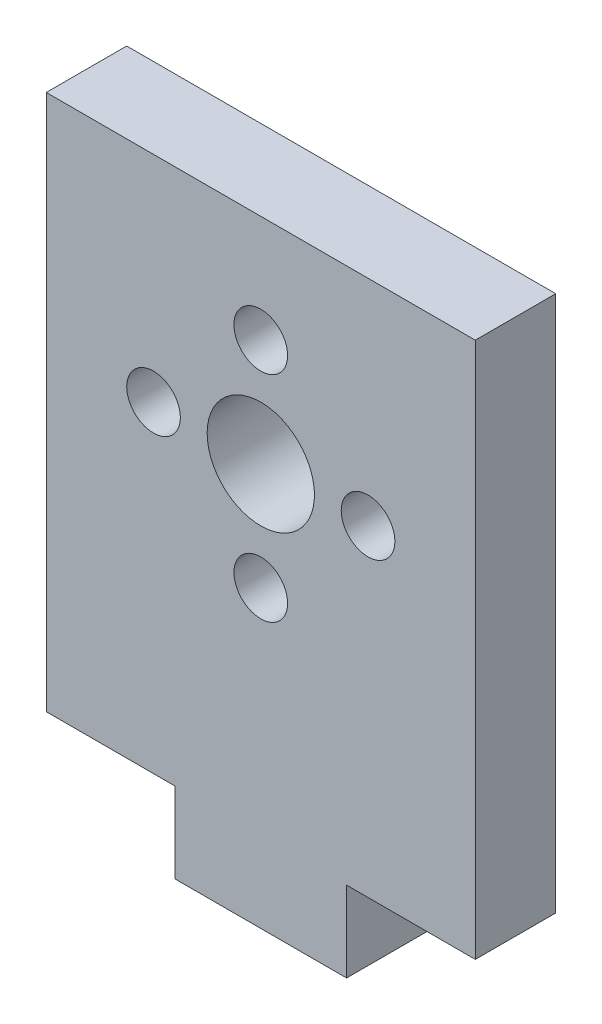
ISO-10303-21;
HEADER;
FILE_DESCRIPTION(('STEP AP214'),'2;1');
FILE_NAME('part.step','',(''),(''),'','','');
FILE_SCHEMA(('AUTOMOTIVE_DESIGN { 1 0 10303 214 1 1 1 1 }'));
ENDSEC;
DATA;
#1=APPLICATION_CONTEXT('core data for automotive mechanical design processes');
#2=APPLICATION_PROTOCOL_DEFINITION('international standard','automotive_design',2000,#1);
#3=PRODUCT_CONTEXT('',#1,'mechanical');
#4=PRODUCT('Part','Part','',(#3));
#5=PRODUCT_RELATED_PRODUCT_CATEGORY('part','',(#4));
#6=PRODUCT_DEFINITION_FORMATION('','',#4);
#7=PRODUCT_DEFINITION_CONTEXT('part definition',#1,'design');
#8=PRODUCT_DEFINITION('design','',#6,#7);
#9=PRODUCT_DEFINITION_SHAPE('','',#8);
#10=(LENGTH_UNIT() NAMED_UNIT(*) SI_UNIT(.MILLI.,.METRE.));
#11=(NAMED_UNIT(*) PLANE_ANGLE_UNIT() SI_UNIT($,.RADIAN.));
#12=(NAMED_UNIT(*) SI_UNIT($,.STERADIAN.) SOLID_ANGLE_UNIT());
#13=UNCERTAINTY_MEASURE_WITH_UNIT(LENGTH_MEASURE(1.E-05),#10,'distance_accuracy_value','');
#14=(GEOMETRIC_REPRESENTATION_CONTEXT(3) GLOBAL_UNCERTAINTY_ASSIGNED_CONTEXT((#13)) GLOBAL_UNIT_ASSIGNED_CONTEXT((#10,
#11,#12)) REPRESENTATION_CONTEXT('',''));
#15=CARTESIAN_POINT('',(0.,0.,0.));
#16=DIRECTION('',(0.,0.,1.));
#17=DIRECTION('',(1.,0.,0.));
#18=AXIS2_PLACEMENT_3D('',#15,#16,#17);
#19=CARTESIAN_POINT('',(0.,0.,4.7625));
#20=DIRECTION('',(0.,0.,1.));
#21=DIRECTION('',(1.,0.,0.));
#22=AXIS2_PLACEMENT_3D('',#19,#20,#21);
#23=PLANE('',#22);
#24=CARTESIAN_POINT('',(6.35,19.05,4.7625));
#25=DIRECTION('',(0.,0.,1.));
#26=DIRECTION('',(1.,0.,0.));
#27=AXIS2_PLACEMENT_3D('',#24,#25,#26);
#28=CIRCLE('',#27,1.5875);
#29=CARTESIAN_POINT('',(4.7625,19.05,4.7625));
#30=VERTEX_POINT('',#29);
#31=EDGE_CURVE('E194',#30,#30,#28,.T.);
#32=ORIENTED_EDGE('',*,*,#31,.F.);
#33=EDGE_LOOP('',(#32));
#34=FACE_BOUND('',#33,.T.);
#35=CARTESIAN_POINT('',(12.7,25.4,4.7625));
#36=DIRECTION('',(0.,0.,1.));
#37=DIRECTION('',(1.,0.,0.));
#38=AXIS2_PLACEMENT_3D('',#35,#36,#37);
#39=CIRCLE('',#38,1.5875);
#40=CARTESIAN_POINT('',(11.1125,25.4,4.7625));
#41=VERTEX_POINT('',#40);
#42=EDGE_CURVE('E182',#41,#41,#39,.T.);
#43=ORIENTED_EDGE('',*,*,#42,.F.);
#44=EDGE_LOOP('',(#43));
#45=FACE_BOUND('',#44,.T.);
#46=DIRECTION('',(1.,0.,0.));
#47=VECTOR('',#46,1.);
#48=CARTESIAN_POINT('',(7.62,-4.7625,4.7625));
#49=LINE('',#48,#47);
#50=CARTESIAN_POINT('',(7.62,-4.7625,4.7625));
#51=VERTEX_POINT('',#50);
#52=CARTESIAN_POINT('',(17.78,-4.7625,4.7625));
#53=VERTEX_POINT('',#52);
#54=EDGE_CURVE('E145',#51,#53,#49,.T.);
#55=ORIENTED_EDGE('',*,*,#54,.T.);
#56=DIRECTION('',(0.,1.,0.));
#57=VECTOR('',#56,1.);
#58=CARTESIAN_POINT('',(17.78,-4.7625,4.7625));
#59=LINE('',#58,#57);
#60=CARTESIAN_POINT('',(17.78,0.,4.7625));
#61=VERTEX_POINT('',#60);
#62=EDGE_CURVE('E93',#53,#61,#59,.T.);
#63=ORIENTED_EDGE('',*,*,#62,.T.);
#64=DIRECTION('',(1.,0.,0.));
#65=VECTOR('',#64,1.);
#66=CARTESIAN_POINT('',(17.78,0.,4.7625));
#67=LINE('',#66,#65);
#68=CARTESIAN_POINT('',(25.4,0.,4.7625));
#69=VERTEX_POINT('',#68);
#70=EDGE_CURVE('E160',#61,#69,#67,.T.);
#71=ORIENTED_EDGE('',*,*,#70,.T.);
#72=DIRECTION('',(0.,1.,0.));
#73=VECTOR('',#72,1.);
#74=CARTESIAN_POINT('',(25.4,0.,4.7625));
#75=LINE('',#74,#73);
#76=CARTESIAN_POINT('',(25.4,31.75,4.7625));
#77=VERTEX_POINT('',#76);
#78=EDGE_CURVE('E173',#69,#77,#75,.T.);
#79=ORIENTED_EDGE('',*,*,#78,.T.);
#80=DIRECTION('',(-1.,0.,0.));
#81=VECTOR('',#80,1.);
#82=CARTESIAN_POINT('',(25.4,31.75,4.7625));
#83=LINE('',#82,#81);
#84=CARTESIAN_POINT('',(0.,31.75,4.7625));
#85=VERTEX_POINT('',#84);
#86=EDGE_CURVE('E112',#77,#85,#83,.T.);
#87=ORIENTED_EDGE('',*,*,#86,.T.);
#88=DIRECTION('',(0.,-1.,0.));
#89=VECTOR('',#88,1.);
#90=CARTESIAN_POINT('',(0.,31.75,4.7625));
#91=LINE('',#90,#89);
#92=CARTESIAN_POINT('',(0.,0.,4.7625));
#93=VERTEX_POINT('',#92);
#94=EDGE_CURVE('E106',#85,#93,#91,.T.);
#95=ORIENTED_EDGE('',*,*,#94,.T.);
#96=DIRECTION('',(1.,0.,0.));
#97=VECTOR('',#96,1.);
#98=CARTESIAN_POINT('',(0.,0.,4.7625));
#99=LINE('',#98,#97);
#100=CARTESIAN_POINT('',(7.62,0.,4.7625));
#101=VERTEX_POINT('',#100);
#102=EDGE_CURVE('E110',#93,#101,#99,.T.);
#103=ORIENTED_EDGE('',*,*,#102,.T.);
#104=DIRECTION('',(0.,-1.,0.));
#105=VECTOR('',#104,1.);
#106=CARTESIAN_POINT('',(7.62,0.,4.7625));
#107=LINE('',#106,#105);
#108=EDGE_CURVE('E50',#101,#51,#107,.T.);
#109=ORIENTED_EDGE('',*,*,#108,.T.);
#110=EDGE_LOOP('',(#55,#63,#71,#79,#87,#95,#103,#109));
#111=FACE_BOUND('',#110,.T.);
#112=CARTESIAN_POINT('',(12.7,19.05,4.7625));
#113=DIRECTION('',(0.,0.,1.));
#114=DIRECTION('',(1.,0.,0.));
#115=AXIS2_PLACEMENT_3D('',#112,#113,#114);
#116=CIRCLE('',#115,3.175);
#117=CARTESIAN_POINT('',(9.525,19.05,4.7625));
#118=VERTEX_POINT('',#117);
#119=EDGE_CURVE('E134',#118,#118,#116,.T.);
#120=ORIENTED_EDGE('',*,*,#119,.F.);
#121=EDGE_LOOP('',(#120));
#122=FACE_BOUND('',#121,.T.);
#123=CARTESIAN_POINT('',(19.05,19.05,4.7625));
#124=DIRECTION('',(0.,0.,1.));
#125=DIRECTION('',(1.,0.,0.));
#126=AXIS2_PLACEMENT_3D('',#123,#124,#125);
#127=CIRCLE('',#126,1.58750000000001);
#128=CARTESIAN_POINT('',(17.4625,19.05,4.7625));
#129=VERTEX_POINT('',#128);
#130=EDGE_CURVE('E188',#129,#129,#127,.T.);
#131=ORIENTED_EDGE('',*,*,#130,.F.);
#132=EDGE_LOOP('',(#131));
#133=FACE_BOUND('',#132,.T.);
#134=CARTESIAN_POINT('',(12.7,12.7,4.7625));
#135=DIRECTION('',(0.,0.,1.));
#136=DIRECTION('',(1.,0.,0.));
#137=AXIS2_PLACEMENT_3D('',#134,#135,#136);
#138=CIRCLE('',#137,1.5875);
#139=CARTESIAN_POINT('',(11.1125,12.7,4.7625));
#140=VERTEX_POINT('',#139);
#141=EDGE_CURVE('E200',#140,#140,#138,.T.);
#142=ORIENTED_EDGE('',*,*,#141,.F.);
#143=EDGE_LOOP('',(#142));
#144=FACE_BOUND('',#143,.T.);
#145=ADVANCED_FACE('F33',(#34,#45,#111,#122,#133,#144),#23,.T.);
#146=CARTESIAN_POINT('',(0.,0.,0.));
#147=DIRECTION('',(0.,0.,1.));
#148=DIRECTION('',(1.,0.,0.));
#149=AXIS2_PLACEMENT_3D('',#146,#147,#148);
#150=PLANE('',#149);
#151=DIRECTION('',(1.,0.,0.));
#152=VECTOR('',#151,1.);
#153=CARTESIAN_POINT('',(7.62,-4.7625,0.));
#154=LINE('',#153,#152);
#155=CARTESIAN_POINT('',(7.62,-4.7625,0.));
#156=VERTEX_POINT('',#155);
#157=CARTESIAN_POINT('',(17.78,-4.7625,0.));
#158=VERTEX_POINT('',#157);
#159=EDGE_CURVE('E130',#156,#158,#154,.T.);
#160=ORIENTED_EDGE('',*,*,#159,.F.);
#161=DIRECTION('',(0.,-1.,0.));
#162=VECTOR('',#161,1.);
#163=CARTESIAN_POINT('',(7.62,0.,0.));
#164=LINE('',#163,#162);
#165=CARTESIAN_POINT('',(7.62,0.,0.));
#166=VERTEX_POINT('',#165);
#167=EDGE_CURVE('E85',#166,#156,#164,.T.);
#168=ORIENTED_EDGE('',*,*,#167,.F.);
#169=DIRECTION('',(1.,0.,0.));
#170=VECTOR('',#169,1.);
#171=CARTESIAN_POINT('',(0.,0.,0.));
#172=LINE('',#171,#170);
#173=CARTESIAN_POINT('',(0.,0.,0.));
#174=VERTEX_POINT('',#173);
#175=EDGE_CURVE('E79',#174,#166,#172,.T.);
#176=ORIENTED_EDGE('',*,*,#175,.F.);
#177=DIRECTION('',(0.,-1.,0.));
#178=VECTOR('',#177,1.);
#179=CARTESIAN_POINT('',(0.,31.75,0.));
#180=LINE('',#179,#178);
#181=CARTESIAN_POINT('',(0.,31.75,0.));
#182=VERTEX_POINT('',#181);
#183=EDGE_CURVE('E120',#182,#174,#180,.T.);
#184=ORIENTED_EDGE('',*,*,#183,.F.);
#185=DIRECTION('',(-1.,0.,0.));
#186=VECTOR('',#185,1.);
#187=CARTESIAN_POINT('',(25.4,31.75,0.));
#188=LINE('',#187,#186);
#189=CARTESIAN_POINT('',(25.4,31.75,0.));
#190=VERTEX_POINT('',#189);
#191=EDGE_CURVE('E140',#190,#182,#188,.T.);
#192=ORIENTED_EDGE('',*,*,#191,.F.);
#193=DIRECTION('',(0.,1.,0.));
#194=VECTOR('',#193,1.);
#195=CARTESIAN_POINT('',(25.4,0.,0.));
#196=LINE('',#195,#194);
#197=CARTESIAN_POINT('',(25.4,0.,0.));
#198=VERTEX_POINT('',#197);
#199=EDGE_CURVE('E138',#198,#190,#196,.T.);
#200=ORIENTED_EDGE('',*,*,#199,.F.);
#201=DIRECTION('',(1.,0.,0.));
#202=VECTOR('',#201,1.);
#203=CARTESIAN_POINT('',(17.78,0.,0.));
#204=LINE('',#203,#202);
#205=CARTESIAN_POINT('',(17.78,0.,0.));
#206=VERTEX_POINT('',#205);
#207=EDGE_CURVE('E136',#206,#198,#204,.T.);
#208=ORIENTED_EDGE('',*,*,#207,.F.);
#209=DIRECTION('',(0.,1.,0.));
#210=VECTOR('',#209,1.);
#211=CARTESIAN_POINT('',(17.78,-4.7625,0.));
#212=LINE('',#211,#210);
#213=EDGE_CURVE('E133',#158,#206,#212,.T.);
#214=ORIENTED_EDGE('',*,*,#213,.F.);
#215=EDGE_LOOP('',(#160,#168,#176,#184,#192,#200,#208,#214));
#216=FACE_BOUND('',#215,.T.);
#217=CARTESIAN_POINT('',(12.7,19.05,0.));
#218=DIRECTION('',(0.,0.,1.));
#219=DIRECTION('',(1.,0.,0.));
#220=AXIS2_PLACEMENT_3D('',#217,#218,#219);
#221=CIRCLE('',#220,3.175);
#222=CARTESIAN_POINT('',(9.525,19.05,0.));
#223=VERTEX_POINT('',#222);
#224=EDGE_CURVE('E179',#223,#223,#221,.T.);
#225=ORIENTED_EDGE('',*,*,#224,.T.);
#226=EDGE_LOOP('',(#225));
#227=FACE_BOUND('',#226,.T.);
#228=CARTESIAN_POINT('',(12.7,25.4,0.));
#229=DIRECTION('',(0.,0.,1.));
#230=DIRECTION('',(1.,0.,0.));
#231=AXIS2_PLACEMENT_3D('',#228,#229,#230);
#232=CIRCLE('',#231,1.5875);
#233=CARTESIAN_POINT('',(11.1125,25.4,0.));
#234=VERTEX_POINT('',#233);
#235=EDGE_CURVE('E185',#234,#234,#232,.T.);
#236=ORIENTED_EDGE('',*,*,#235,.T.);
#237=EDGE_LOOP('',(#236));
#238=FACE_BOUND('',#237,.T.);
#239=CARTESIAN_POINT('',(19.05,19.05,0.));
#240=DIRECTION('',(0.,0.,1.));
#241=DIRECTION('',(1.,0.,0.));
#242=AXIS2_PLACEMENT_3D('',#239,#240,#241);
#243=CIRCLE('',#242,1.58750000000001);
#244=CARTESIAN_POINT('',(17.4625,19.05,0.));
#245=VERTEX_POINT('',#244);
#246=EDGE_CURVE('E191',#245,#245,#243,.T.);
#247=ORIENTED_EDGE('',*,*,#246,.T.);
#248=EDGE_LOOP('',(#247));
#249=FACE_BOUND('',#248,.T.);
#250=CARTESIAN_POINT('',(6.35,19.05,0.));
#251=DIRECTION('',(0.,0.,1.));
#252=DIRECTION('',(1.,0.,0.));
#253=AXIS2_PLACEMENT_3D('',#250,#251,#252);
#254=CIRCLE('',#253,1.5875);
#255=CARTESIAN_POINT('',(4.7625,19.05,0.));
#256=VERTEX_POINT('',#255);
#257=EDGE_CURVE('E197',#256,#256,#254,.T.);
#258=ORIENTED_EDGE('',*,*,#257,.T.);
#259=EDGE_LOOP('',(#258));
#260=FACE_BOUND('',#259,.T.);
#261=CARTESIAN_POINT('',(12.7,12.7,0.));
#262=DIRECTION('',(0.,0.,1.));
#263=DIRECTION('',(1.,0.,0.));
#264=AXIS2_PLACEMENT_3D('',#261,#262,#263);
#265=CIRCLE('',#264,1.5875);
#266=CARTESIAN_POINT('',(11.1125,12.7,0.));
#267=VERTEX_POINT('',#266);
#268=EDGE_CURVE('E203',#267,#267,#265,.T.);
#269=ORIENTED_EDGE('',*,*,#268,.T.);
#270=EDGE_LOOP('',(#269));
#271=FACE_BOUND('',#270,.T.);
#272=ADVANCED_FACE('F164',(#216,#227,#238,#249,#260,#271),#150,.F.);
#273=CARTESIAN_POINT('',(7.62,-4.7625,4.7625));
#274=DIRECTION('',(0.,1.,0.));
#275=DIRECTION('',(-1.,0.,0.));
#276=AXIS2_PLACEMENT_3D('',#273,#274,#275);
#277=PLANE('',#276);
#278=ORIENTED_EDGE('',*,*,#159,.T.);
#279=DIRECTION('',(0.,0.,-1.));
#280=VECTOR('',#279,1.);
#281=CARTESIAN_POINT('',(17.78,-4.7625,4.7625));
#282=LINE('',#281,#280);
#283=EDGE_CURVE('E11',#53,#158,#282,.T.);
#284=ORIENTED_EDGE('',*,*,#283,.F.);
#285=ORIENTED_EDGE('',*,*,#54,.F.);
#286=DIRECTION('',(0.,0.,-1.));
#287=VECTOR('',#286,1.);
#288=CARTESIAN_POINT('',(7.62,-4.7625,4.7625));
#289=LINE('',#288,#287);
#290=EDGE_CURVE('E126',#51,#156,#289,.T.);
#291=ORIENTED_EDGE('',*,*,#290,.T.);
#292=EDGE_LOOP('',(#278,#284,#285,#291));
#293=FACE_BOUND('',#292,.T.);
#294=ADVANCED_FACE('F35',(#293),#277,.F.);
#295=CARTESIAN_POINT('',(17.78,-4.7625,4.7625));
#296=DIRECTION('',(-1.,0.,0.));
#297=DIRECTION('',(0.,0.,1.));
#298=AXIS2_PLACEMENT_3D('',#295,#296,#297);
#299=PLANE('',#298);
#300=ORIENTED_EDGE('',*,*,#213,.T.);
#301=DIRECTION('',(0.,0.,-1.));
#302=VECTOR('',#301,1.);
#303=CARTESIAN_POINT('',(17.78,0.,4.7625));
#304=LINE('',#303,#302);
#305=EDGE_CURVE('E42',#61,#206,#304,.T.);
#306=ORIENTED_EDGE('',*,*,#305,.F.);
#307=ORIENTED_EDGE('',*,*,#62,.F.);
#308=ORIENTED_EDGE('',*,*,#283,.T.);
#309=EDGE_LOOP('',(#300,#306,#307,#308));
#310=FACE_BOUND('',#309,.T.);
#311=ADVANCED_FACE('F237',(#310),#299,.F.);
#312=CARTESIAN_POINT('',(17.78,0.,4.7625));
#313=DIRECTION('',(0.,1.,0.));
#314=DIRECTION('',(-1.,0.,0.));
#315=AXIS2_PLACEMENT_3D('',#312,#313,#314);
#316=PLANE('',#315);
#317=ORIENTED_EDGE('',*,*,#207,.T.);
#318=DIRECTION('',(0.,0.,-1.));
#319=VECTOR('',#318,1.);
#320=CARTESIAN_POINT('',(25.4,0.,4.7625));
#321=LINE('',#320,#319);
#322=EDGE_CURVE('E152',#69,#198,#321,.T.);
#323=ORIENTED_EDGE('',*,*,#322,.F.);
#324=ORIENTED_EDGE('',*,*,#70,.F.);
#325=ORIENTED_EDGE('',*,*,#305,.T.);
#326=EDGE_LOOP('',(#317,#323,#324,#325));
#327=FACE_BOUND('',#326,.T.);
#328=ADVANCED_FACE('F158',(#327),#316,.F.);
#329=CARTESIAN_POINT('',(25.4,0.,4.7625));
#330=DIRECTION('',(-1.,0.,0.));
#331=DIRECTION('',(0.,-1.,0.));
#332=AXIS2_PLACEMENT_3D('',#329,#330,#331);
#333=PLANE('',#332);
#334=ORIENTED_EDGE('',*,*,#199,.T.);
#335=DIRECTION('',(0.,0.,-1.));
#336=VECTOR('',#335,1.);
#337=CARTESIAN_POINT('',(25.4,31.75,4.7625));
#338=LINE('',#337,#336);
#339=EDGE_CURVE('E149',#77,#190,#338,.T.);
#340=ORIENTED_EDGE('',*,*,#339,.F.);
#341=ORIENTED_EDGE('',*,*,#78,.F.);
#342=ORIENTED_EDGE('',*,*,#322,.T.);
#343=EDGE_LOOP('',(#334,#340,#341,#342));
#344=FACE_BOUND('',#343,.T.);
#345=ADVANCED_FACE('F169',(#344),#333,.F.);
#346=CARTESIAN_POINT('',(25.4,31.75,4.7625));
#347=DIRECTION('',(0.,-1.,0.));
#348=DIRECTION('',(0.,0.,-1.));
#349=AXIS2_PLACEMENT_3D('',#346,#347,#348);
#350=PLANE('',#349);
#351=ORIENTED_EDGE('',*,*,#191,.T.);
#352=DIRECTION('',(0.,0.,-1.));
#353=VECTOR('',#352,1.);
#354=CARTESIAN_POINT('',(0.,31.75,4.7625));
#355=LINE('',#354,#353);
#356=EDGE_CURVE('E121',#85,#182,#355,.T.);
#357=ORIENTED_EDGE('',*,*,#356,.F.);
#358=ORIENTED_EDGE('',*,*,#86,.F.);
#359=ORIENTED_EDGE('',*,*,#339,.T.);
#360=EDGE_LOOP('',(#351,#357,#358,#359));
#361=FACE_BOUND('',#360,.T.);
#362=ADVANCED_FACE('F172',(#361),#350,.F.);
#363=CARTESIAN_POINT('',(0.,31.75,4.7625));
#364=DIRECTION('',(1.,0.,0.));
#365=DIRECTION('',(0.,0.,-1.));
#366=AXIS2_PLACEMENT_3D('',#363,#364,#365);
#367=PLANE('',#366);
#368=ORIENTED_EDGE('',*,*,#183,.T.);
#369=DIRECTION('',(0.,0.,-1.));
#370=VECTOR('',#369,1.);
#371=CARTESIAN_POINT('',(0.,0.,4.7625));
#372=LINE('',#371,#370);
#373=EDGE_CURVE('E117',#93,#174,#372,.T.);
#374=ORIENTED_EDGE('',*,*,#373,.F.);
#375=ORIENTED_EDGE('',*,*,#94,.F.);
#376=ORIENTED_EDGE('',*,*,#356,.T.);
#377=EDGE_LOOP('',(#368,#374,#375,#376));
#378=FACE_BOUND('',#377,.T.);
#379=ADVANCED_FACE('F118',(#378),#367,.F.);
#380=CARTESIAN_POINT('',(0.,0.,4.7625));
#381=DIRECTION('',(0.,1.,0.));
#382=DIRECTION('',(0.,0.,1.));
#383=AXIS2_PLACEMENT_3D('',#380,#381,#382);
#384=PLANE('',#383);
#385=ORIENTED_EDGE('',*,*,#175,.T.);
#386=DIRECTION('',(0.,0.,-1.));
#387=VECTOR('',#386,1.);
#388=CARTESIAN_POINT('',(7.62,0.,4.7625));
#389=LINE('',#388,#387);
#390=EDGE_CURVE('E122',#101,#166,#389,.T.);
#391=ORIENTED_EDGE('',*,*,#390,.F.);
#392=ORIENTED_EDGE('',*,*,#102,.F.);
#393=ORIENTED_EDGE('',*,*,#373,.T.);
#394=EDGE_LOOP('',(#385,#391,#392,#393));
#395=FACE_BOUND('',#394,.T.);
#396=ADVANCED_FACE('F124',(#395),#384,.F.);
#397=CARTESIAN_POINT('',(7.62,0.,4.7625));
#398=DIRECTION('',(1.,0.,0.));
#399=DIRECTION('',(0.,1.,0.));
#400=AXIS2_PLACEMENT_3D('',#397,#398,#399);
#401=PLANE('',#400);
#402=ORIENTED_EDGE('',*,*,#167,.T.);
#403=ORIENTED_EDGE('',*,*,#290,.F.);
#404=ORIENTED_EDGE('',*,*,#108,.F.);
#405=ORIENTED_EDGE('',*,*,#390,.T.);
#406=EDGE_LOOP('',(#402,#403,#404,#405));
#407=FACE_BOUND('',#406,.T.);
#408=ADVANCED_FACE('F225',(#407),#401,.F.);
#409=CARTESIAN_POINT('',(12.7,19.05,4.7625));
#410=DIRECTION('',(0.,0.,-1.));
#411=DIRECTION('',(-1.,0.,0.));
#412=AXIS2_PLACEMENT_3D('',#409,#410,#411);
#413=CYLINDRICAL_SURFACE('',#412,3.175);
#414=CARTESIAN_POINT('',(9.525,19.05,4.7625));
#415=CARTESIAN_POINT('',(9.525,19.05,4.712890625));
#416=CARTESIAN_POINT('',(9.525,19.05,4.66328125));
#417=CARTESIAN_POINT('',(9.525,19.05,4.5640625));
#418=CARTESIAN_POINT('',(9.525,19.05,4.514453125));
#419=CARTESIAN_POINT('',(9.525,19.05,4.415234375));
#420=CARTESIAN_POINT('',(9.525,19.05,4.365625));
#421=CARTESIAN_POINT('',(9.525,19.05,4.26640625));
#422=CARTESIAN_POINT('',(9.525,19.05,4.216796875));
#423=CARTESIAN_POINT('',(9.525,19.05,4.117578125));
#424=CARTESIAN_POINT('',(9.525,19.05,4.06796875));
#425=CARTESIAN_POINT('',(9.525,19.05,3.96875));
#426=CARTESIAN_POINT('',(9.525,19.05,3.919140625));
#427=CARTESIAN_POINT('',(9.525,19.05,3.819921875));
#428=CARTESIAN_POINT('',(9.525,19.05,3.7703125));
#429=CARTESIAN_POINT('',(9.525,19.05,3.67109375));
#430=CARTESIAN_POINT('',(9.525,19.05,3.621484375));
#431=CARTESIAN_POINT('',(9.525,19.05,3.522265625));
#432=CARTESIAN_POINT('',(9.525,19.05,3.47265625));
#433=CARTESIAN_POINT('',(9.525,19.05,3.3734375));
#434=CARTESIAN_POINT('',(9.525,19.05,3.323828125));
#435=CARTESIAN_POINT('',(9.525,19.05,3.224609375));
#436=CARTESIAN_POINT('',(9.525,19.05,3.175));
#437=CARTESIAN_POINT('',(9.525,19.05,3.07578125));
#438=CARTESIAN_POINT('',(9.525,19.05,3.026171875));
#439=CARTESIAN_POINT('',(9.525,19.05,2.926953125));
#440=CARTESIAN_POINT('',(9.525,19.05,2.87734375));
#441=CARTESIAN_POINT('',(9.525,19.05,2.778125));
#442=CARTESIAN_POINT('',(9.525,19.05,2.728515625));
#443=CARTESIAN_POINT('',(9.525,19.05,2.629296875));
#444=CARTESIAN_POINT('',(9.525,19.05,2.5796875));
#445=CARTESIAN_POINT('',(9.525,19.05,2.48046875));
#446=CARTESIAN_POINT('',(9.525,19.05,2.430859375));
#447=CARTESIAN_POINT('',(9.525,19.05,2.331640625));
#448=CARTESIAN_POINT('',(9.525,19.05,2.28203125));
#449=CARTESIAN_POINT('',(9.525,19.05,2.1828125));
#450=CARTESIAN_POINT('',(9.525,19.05,2.133203125));
#451=CARTESIAN_POINT('',(9.525,19.05,2.033984375));
#452=CARTESIAN_POINT('',(9.525,19.05,1.984375));
#453=CARTESIAN_POINT('',(9.525,19.05,1.88515625));
#454=CARTESIAN_POINT('',(9.525,19.05,1.835546875));
#455=CARTESIAN_POINT('',(9.525,19.05,1.736328125));
#456=CARTESIAN_POINT('',(9.525,19.05,1.68671875));
#457=CARTESIAN_POINT('',(9.525,19.05,1.5875));
#458=CARTESIAN_POINT('',(9.525,19.05,1.537890625));
#459=CARTESIAN_POINT('',(9.525,19.05,1.438671875));
#460=CARTESIAN_POINT('',(9.525,19.05,1.3890625));
#461=CARTESIAN_POINT('',(9.525,19.05,1.28984375));
#462=CARTESIAN_POINT('',(9.525,19.05,1.240234375));
#463=CARTESIAN_POINT('',(9.525,19.05,1.141015625));
#464=CARTESIAN_POINT('',(9.525,19.05,1.09140625));
#465=CARTESIAN_POINT('',(9.525,19.05,0.9921875));
#466=CARTESIAN_POINT('',(9.525,19.05,0.942578125));
#467=CARTESIAN_POINT('',(9.525,19.05,0.843359375));
#468=CARTESIAN_POINT('',(9.525,19.05,0.79375));
#469=CARTESIAN_POINT('',(9.525,19.05,0.69453125));
#470=CARTESIAN_POINT('',(9.525,19.05,0.644921875));
#471=CARTESIAN_POINT('',(9.525,19.05,0.545703125));
#472=CARTESIAN_POINT('',(9.525,19.05,0.49609375));
#473=CARTESIAN_POINT('',(9.525,19.05,0.396875));
#474=CARTESIAN_POINT('',(9.525,19.05,0.347265625));
#475=CARTESIAN_POINT('',(9.525,19.05,0.248046875));
#476=CARTESIAN_POINT('',(9.525,19.05,0.1984375));
#477=CARTESIAN_POINT('',(9.525,19.05,0.09921875));
#478=CARTESIAN_POINT('',(9.525,19.05,0.049609375));
#479=CARTESIAN_POINT('',(9.525,19.05,0.));
#480=B_SPLINE_CURVE_WITH_KNOTS('',3,(#414,#415,#416,#417,#418,#419,#420,#421,#422,#423,#424,
#425,#426,#427,#428,#429,#430,#431,#432,#433,#434,#435,#436,#437,#438,#439,#440,#441,#442,#443,
#444,#445,#446,#447,#448,#449,#450,#451,#452,#453,#454,#455,#456,#457,#458,#459,#460,#461,#462,
#463,#464,#465,#466,#467,#468,#469,#470,#471,#472,#473,#474,#475,#476,#477,#478,#479),
.UNSPECIFIED.,.F.,.F.,(4,2,2,2,2,2,2,2,2,2,2,2,2,2,2,2,2,2,2,2,2,2,2,2,2,2,2,2,2,2,2,2,4),(0.,
0.148828124999999,0.297656249999999,0.446484374999999,0.595312499999999,0.744140625,0.89296875,
1.041796875,1.190625,1.339453125,1.48828125,1.637109375,1.7859375,1.934765625,2.08359375,
2.232421875,2.38125,2.530078125,2.67890625,2.827734375,2.9765625,3.125390625,3.27421875,
3.423046875,3.571875,3.720703125,3.86953125,4.018359375,4.1671875,4.316015625,4.46484375,
4.613671875,4.7625),.UNSPECIFIED.);
#481=EDGE_CURVE('BSEAM222',#118,#223,#480,.T.);
#482=ORIENTED_EDGE('',*,*,#119,.T.);
#483=ORIENTED_EDGE('',*,*,#224,.F.);
#484=ORIENTED_EDGE('',*,*,#481,.T.);
#485=ORIENTED_EDGE('',*,*,#481,.F.);
#486=EDGE_LOOP('',(#482,#484,#483,#485));
#487=FACE_BOUND('',#486,.T.);
#488=ADVANCED_FACE('F222',(#487),#413,.F.);
#489=CARTESIAN_POINT('',(12.7,25.4,4.7625));
#490=DIRECTION('',(0.,0.,-1.));
#491=DIRECTION('',(-1.,0.,0.));
#492=AXIS2_PLACEMENT_3D('',#489,#490,#491);
#493=CYLINDRICAL_SURFACE('',#492,1.5875);
#494=CARTESIAN_POINT('',(11.1125,25.4,4.7625));
#495=CARTESIAN_POINT('',(11.1125,25.4,4.712890625));
#496=CARTESIAN_POINT('',(11.1125,25.4,4.66328125));
#497=CARTESIAN_POINT('',(11.1125,25.4,4.5640625));
#498=CARTESIAN_POINT('',(11.1125,25.4,4.514453125));
#499=CARTESIAN_POINT('',(11.1125,25.4,4.415234375));
#500=CARTESIAN_POINT('',(11.1125,25.4,4.365625));
#501=CARTESIAN_POINT('',(11.1125,25.4,4.26640625));
#502=CARTESIAN_POINT('',(11.1125,25.4,4.216796875));
#503=CARTESIAN_POINT('',(11.1125,25.4,4.117578125));
#504=CARTESIAN_POINT('',(11.1125,25.4,4.06796875));
#505=CARTESIAN_POINT('',(11.1125,25.4,3.96875));
#506=CARTESIAN_POINT('',(11.1125,25.4,3.919140625));
#507=CARTESIAN_POINT('',(11.1125,25.4,3.819921875));
#508=CARTESIAN_POINT('',(11.1125,25.4,3.7703125));
#509=CARTESIAN_POINT('',(11.1125,25.4,3.67109375));
#510=CARTESIAN_POINT('',(11.1125,25.4,3.621484375));
#511=CARTESIAN_POINT('',(11.1125,25.4,3.522265625));
#512=CARTESIAN_POINT('',(11.1125,25.4,3.47265625));
#513=CARTESIAN_POINT('',(11.1125,25.4,3.3734375));
#514=CARTESIAN_POINT('',(11.1125,25.4,3.323828125));
#515=CARTESIAN_POINT('',(11.1125,25.4,3.224609375));
#516=CARTESIAN_POINT('',(11.1125,25.4,3.175));
#517=CARTESIAN_POINT('',(11.1125,25.4,3.07578125));
#518=CARTESIAN_POINT('',(11.1125,25.4,3.026171875));
#519=CARTESIAN_POINT('',(11.1125,25.4,2.926953125));
#520=CARTESIAN_POINT('',(11.1125,25.4,2.87734375));
#521=CARTESIAN_POINT('',(11.1125,25.4,2.778125));
#522=CARTESIAN_POINT('',(11.1125,25.4,2.728515625));
#523=CARTESIAN_POINT('',(11.1125,25.4,2.629296875));
#524=CARTESIAN_POINT('',(11.1125,25.4,2.5796875));
#525=CARTESIAN_POINT('',(11.1125,25.4,2.48046875));
#526=CARTESIAN_POINT('',(11.1125,25.4,2.430859375));
#527=CARTESIAN_POINT('',(11.1125,25.4,2.331640625));
#528=CARTESIAN_POINT('',(11.1125,25.4,2.28203125));
#529=CARTESIAN_POINT('',(11.1125,25.4,2.1828125));
#530=CARTESIAN_POINT('',(11.1125,25.4,2.133203125));
#531=CARTESIAN_POINT('',(11.1125,25.4,2.033984375));
#532=CARTESIAN_POINT('',(11.1125,25.4,1.984375));
#533=CARTESIAN_POINT('',(11.1125,25.4,1.88515625));
#534=CARTESIAN_POINT('',(11.1125,25.4,1.835546875));
#535=CARTESIAN_POINT('',(11.1125,25.4,1.736328125));
#536=CARTESIAN_POINT('',(11.1125,25.4,1.68671875));
#537=CARTESIAN_POINT('',(11.1125,25.4,1.5875));
#538=CARTESIAN_POINT('',(11.1125,25.4,1.537890625));
#539=CARTESIAN_POINT('',(11.1125,25.4,1.438671875));
#540=CARTESIAN_POINT('',(11.1125,25.4,1.3890625));
#541=CARTESIAN_POINT('',(11.1125,25.4,1.28984375));
#542=CARTESIAN_POINT('',(11.1125,25.4,1.240234375));
#543=CARTESIAN_POINT('',(11.1125,25.4,1.141015625));
#544=CARTESIAN_POINT('',(11.1125,25.4,1.09140625));
#545=CARTESIAN_POINT('',(11.1125,25.4,0.992187499999999));
#546=CARTESIAN_POINT('',(11.1125,25.4,0.942578124999999));
#547=CARTESIAN_POINT('',(11.1125,25.4,0.843359375));
#548=CARTESIAN_POINT('',(11.1125,25.4,0.79375));
#549=CARTESIAN_POINT('',(11.1125,25.4,0.69453125));
#550=CARTESIAN_POINT('',(11.1125,25.4,0.644921875));
#551=CARTESIAN_POINT('',(11.1125,25.4,0.545703125));
#552=CARTESIAN_POINT('',(11.1125,25.4,0.49609375));
#553=CARTESIAN_POINT('',(11.1125,25.4,0.396875));
#554=CARTESIAN_POINT('',(11.1125,25.4,0.347265625));
#555=CARTESIAN_POINT('',(11.1125,25.4,0.248046875));
#556=CARTESIAN_POINT('',(11.1125,25.4,0.1984375));
#557=CARTESIAN_POINT('',(11.1125,25.4,0.09921875));
#558=CARTESIAN_POINT('',(11.1125,25.4,0.049609375));
#559=CARTESIAN_POINT('',(11.1125,25.4,0.));
#560=B_SPLINE_CURVE_WITH_KNOTS('',3,(#494,#495,#496,#497,#498,#499,#500,#501,#502,#503,#504,
#505,#506,#507,#508,#509,#510,#511,#512,#513,#514,#515,#516,#517,#518,#519,#520,#521,#522,#523,
#524,#525,#526,#527,#528,#529,#530,#531,#532,#533,#534,#535,#536,#537,#538,#539,#540,#541,#542,
#543,#544,#545,#546,#547,#548,#549,#550,#551,#552,#553,#554,#555,#556,#557,#558,#559),
.UNSPECIFIED.,.F.,.F.,(4,2,2,2,2,2,2,2,2,2,2,2,2,2,2,2,2,2,2,2,2,2,2,2,2,2,2,2,2,2,2,2,4),(0.,
0.148828125,0.29765625,0.446484375,0.5953125,0.744140625,0.892968750000001,1.041796875,1.190625,
1.339453125,1.48828125,1.637109375,1.7859375,1.934765625,2.08359375,2.232421875,2.38125,
2.530078125,2.67890625,2.827734375,2.9765625,3.125390625,3.27421875,3.423046875,3.571875,
3.720703125,3.86953125,4.018359375,4.1671875,4.316015625,4.46484375,4.613671875,4.7625),.UNSPECIFIED.);
#561=EDGE_CURVE('BSEAM301',#41,#234,#560,.T.);
#562=ORIENTED_EDGE('',*,*,#42,.T.);
#563=ORIENTED_EDGE('',*,*,#235,.F.);
#564=ORIENTED_EDGE('',*,*,#561,.T.);
#565=ORIENTED_EDGE('',*,*,#561,.F.);
#566=EDGE_LOOP('',(#562,#564,#563,#565));
#567=FACE_BOUND('',#566,.T.);
#568=ADVANCED_FACE('F301',(#567),#493,.F.);
#569=CARTESIAN_POINT('',(19.05,19.05,4.7625));
#570=DIRECTION('',(0.,0.,-1.));
#571=DIRECTION('',(-1.,0.,0.));
#572=AXIS2_PLACEMENT_3D('',#569,#570,#571);
#573=CYLINDRICAL_SURFACE('',#572,1.58750000000001);
#574=CARTESIAN_POINT('',(17.4625,19.05,4.7625));
#575=CARTESIAN_POINT('',(17.4625,19.05,4.712890625));
#576=CARTESIAN_POINT('',(17.4625,19.05,4.66328125));
#577=CARTESIAN_POINT('',(17.4625,19.05,4.5640625));
#578=CARTESIAN_POINT('',(17.4625,19.05,4.514453125));
#579=CARTESIAN_POINT('',(17.4625,19.05,4.415234375));
#580=CARTESIAN_POINT('',(17.4625,19.05,4.365625));
#581=CARTESIAN_POINT('',(17.4625,19.05,4.26640625));
#582=CARTESIAN_POINT('',(17.4625,19.05,4.216796875));
#583=CARTESIAN_POINT('',(17.4625,19.05,4.117578125));
#584=CARTESIAN_POINT('',(17.4625,19.05,4.06796875));
#585=CARTESIAN_POINT('',(17.4625,19.05,3.96875));
#586=CARTESIAN_POINT('',(17.4625,19.05,3.919140625));
#587=CARTESIAN_POINT('',(17.4625,19.05,3.819921875));
#588=CARTESIAN_POINT('',(17.4625,19.05,3.7703125));
#589=CARTESIAN_POINT('',(17.4625,19.05,3.67109375));
#590=CARTESIAN_POINT('',(17.4625,19.05,3.621484375));
#591=CARTESIAN_POINT('',(17.4625,19.05,3.522265625));
#592=CARTESIAN_POINT('',(17.4625,19.05,3.47265625));
#593=CARTESIAN_POINT('',(17.4625,19.05,3.3734375));
#594=CARTESIAN_POINT('',(17.4625,19.05,3.323828125));
#595=CARTESIAN_POINT('',(17.4625,19.05,3.224609375));
#596=CARTESIAN_POINT('',(17.4625,19.05,3.175));
#597=CARTESIAN_POINT('',(17.4625,19.05,3.07578125));
#598=CARTESIAN_POINT('',(17.4625,19.05,3.026171875));
#599=CARTESIAN_POINT('',(17.4625,19.05,2.926953125));
#600=CARTESIAN_POINT('',(17.4625,19.05,2.87734375));
#601=CARTESIAN_POINT('',(17.4625,19.05,2.778125));
#602=CARTESIAN_POINT('',(17.4625,19.05,2.728515625));
#603=CARTESIAN_POINT('',(17.4625,19.05,2.629296875));
#604=CARTESIAN_POINT('',(17.4625,19.05,2.5796875));
#605=CARTESIAN_POINT('',(17.4625,19.05,2.48046875));
#606=CARTESIAN_POINT('',(17.4625,19.05,2.430859375));
#607=CARTESIAN_POINT('',(17.4625,19.05,2.331640625));
#608=CARTESIAN_POINT('',(17.4625,19.05,2.28203125));
#609=CARTESIAN_POINT('',(17.4625,19.05,2.1828125));
#610=CARTESIAN_POINT('',(17.4625,19.05,2.133203125));
#611=CARTESIAN_POINT('',(17.4625,19.05,2.033984375));
#612=CARTESIAN_POINT('',(17.4625,19.05,1.984375));
#613=CARTESIAN_POINT('',(17.4625,19.05,1.88515625));
#614=CARTESIAN_POINT('',(17.4625,19.05,1.835546875));
#615=CARTESIAN_POINT('',(17.4625,19.05,1.736328125));
#616=CARTESIAN_POINT('',(17.4625,19.05,1.68671875));
#617=CARTESIAN_POINT('',(17.4625,19.05,1.5875));
#618=CARTESIAN_POINT('',(17.4625,19.05,1.537890625));
#619=CARTESIAN_POINT('',(17.4625,19.05,1.438671875));
#620=CARTESIAN_POINT('',(17.4625,19.05,1.3890625));
#621=CARTESIAN_POINT('',(17.4625,19.05,1.28984375));
#622=CARTESIAN_POINT('',(17.4625,19.05,1.240234375));
#623=CARTESIAN_POINT('',(17.4625,19.05,1.141015625));
#624=CARTESIAN_POINT('',(17.4625,19.05,1.09140625));
#625=CARTESIAN_POINT('',(17.4625,19.05,0.992187499999999));
#626=CARTESIAN_POINT('',(17.4625,19.05,0.942578124999999));
#627=CARTESIAN_POINT('',(17.4625,19.05,0.843359375));
#628=CARTESIAN_POINT('',(17.4625,19.05,0.79375));
#629=CARTESIAN_POINT('',(17.4625,19.05,0.69453125));
#630=CARTESIAN_POINT('',(17.4625,19.05,0.644921875));
#631=CARTESIAN_POINT('',(17.4625,19.05,0.545703125));
#632=CARTESIAN_POINT('',(17.4625,19.05,0.49609375));
#633=CARTESIAN_POINT('',(17.4625,19.05,0.396875));
#634=CARTESIAN_POINT('',(17.4625,19.05,0.347265625));
#635=CARTESIAN_POINT('',(17.4625,19.05,0.248046875));
#636=CARTESIAN_POINT('',(17.4625,19.05,0.1984375));
#637=CARTESIAN_POINT('',(17.4625,19.05,0.09921875));
#638=CARTESIAN_POINT('',(17.4625,19.05,0.049609375));
#639=CARTESIAN_POINT('',(17.4625,19.05,0.));
#640=B_SPLINE_CURVE_WITH_KNOTS('',3,(#574,#575,#576,#577,#578,#579,#580,#581,#582,#583,#584,
#585,#586,#587,#588,#589,#590,#591,#592,#593,#594,#595,#596,#597,#598,#599,#600,#601,#602,#603,
#604,#605,#606,#607,#608,#609,#610,#611,#612,#613,#614,#615,#616,#617,#618,#619,#620,#621,#622,
#623,#624,#625,#626,#627,#628,#629,#630,#631,#632,#633,#634,#635,#636,#637,#638,#639),
.UNSPECIFIED.,.F.,.F.,(4,2,2,2,2,2,2,2,2,2,2,2,2,2,2,2,2,2,2,2,2,2,2,2,2,2,2,2,2,2,2,2,4),(0.,
0.148828125,0.29765625,0.446484375,0.5953125,0.744140625,0.892968750000001,1.041796875,1.190625,
1.339453125,1.48828125,1.637109375,1.7859375,1.934765625,2.08359375,2.232421875,2.38125,
2.530078125,2.67890625,2.827734375,2.9765625,3.125390625,3.27421875,3.423046875,3.571875,
3.720703125,3.86953125,4.018359375,4.1671875,4.316015625,4.46484375,4.613671875,4.7625),.UNSPECIFIED.);
#641=EDGE_CURVE('BSEAM309',#129,#245,#640,.T.);
#642=ORIENTED_EDGE('',*,*,#130,.T.);
#643=ORIENTED_EDGE('',*,*,#246,.F.);
#644=ORIENTED_EDGE('',*,*,#641,.T.);
#645=ORIENTED_EDGE('',*,*,#641,.F.);
#646=EDGE_LOOP('',(#642,#644,#643,#645));
#647=FACE_BOUND('',#646,.T.);
#648=ADVANCED_FACE('F309',(#647),#573,.F.);
#649=CARTESIAN_POINT('',(6.35,19.05,4.7625));
#650=DIRECTION('',(0.,0.,-1.));
#651=DIRECTION('',(-1.,0.,0.));
#652=AXIS2_PLACEMENT_3D('',#649,#650,#651);
#653=CYLINDRICAL_SURFACE('',#652,1.5875);
#654=CARTESIAN_POINT('',(4.7625,19.05,4.7625));
#655=CARTESIAN_POINT('',(4.7625,19.05,4.712890625));
#656=CARTESIAN_POINT('',(4.7625,19.05,4.66328125));
#657=CARTESIAN_POINT('',(4.7625,19.05,4.5640625));
#658=CARTESIAN_POINT('',(4.7625,19.05,4.514453125));
#659=CARTESIAN_POINT('',(4.7625,19.05,4.415234375));
#660=CARTESIAN_POINT('',(4.7625,19.05,4.365625));
#661=CARTESIAN_POINT('',(4.7625,19.05,4.26640625));
#662=CARTESIAN_POINT('',(4.7625,19.05,4.216796875));
#663=CARTESIAN_POINT('',(4.7625,19.05,4.117578125));
#664=CARTESIAN_POINT('',(4.7625,19.05,4.06796875));
#665=CARTESIAN_POINT('',(4.7625,19.05,3.96875));
#666=CARTESIAN_POINT('',(4.7625,19.05,3.919140625));
#667=CARTESIAN_POINT('',(4.7625,19.05,3.819921875));
#668=CARTESIAN_POINT('',(4.7625,19.05,3.7703125));
#669=CARTESIAN_POINT('',(4.7625,19.05,3.67109375));
#670=CARTESIAN_POINT('',(4.7625,19.05,3.621484375));
#671=CARTESIAN_POINT('',(4.7625,19.05,3.522265625));
#672=CARTESIAN_POINT('',(4.7625,19.05,3.47265625));
#673=CARTESIAN_POINT('',(4.7625,19.05,3.3734375));
#674=CARTESIAN_POINT('',(4.7625,19.05,3.323828125));
#675=CARTESIAN_POINT('',(4.7625,19.05,3.224609375));
#676=CARTESIAN_POINT('',(4.7625,19.05,3.175));
#677=CARTESIAN_POINT('',(4.7625,19.05,3.07578125));
#678=CARTESIAN_POINT('',(4.7625,19.05,3.026171875));
#679=CARTESIAN_POINT('',(4.7625,19.05,2.926953125));
#680=CARTESIAN_POINT('',(4.7625,19.05,2.87734375));
#681=CARTESIAN_POINT('',(4.7625,19.05,2.778125));
#682=CARTESIAN_POINT('',(4.7625,19.05,2.728515625));
#683=CARTESIAN_POINT('',(4.7625,19.05,2.629296875));
#684=CARTESIAN_POINT('',(4.7625,19.05,2.5796875));
#685=CARTESIAN_POINT('',(4.7625,19.05,2.48046875));
#686=CARTESIAN_POINT('',(4.7625,19.05,2.430859375));
#687=CARTESIAN_POINT('',(4.7625,19.05,2.331640625));
#688=CARTESIAN_POINT('',(4.7625,19.05,2.28203125));
#689=CARTESIAN_POINT('',(4.7625,19.05,2.1828125));
#690=CARTESIAN_POINT('',(4.7625,19.05,2.133203125));
#691=CARTESIAN_POINT('',(4.7625,19.05,2.033984375));
#692=CARTESIAN_POINT('',(4.7625,19.05,1.984375));
#693=CARTESIAN_POINT('',(4.7625,19.05,1.88515625));
#694=CARTESIAN_POINT('',(4.7625,19.05,1.835546875));
#695=CARTESIAN_POINT('',(4.7625,19.05,1.736328125));
#696=CARTESIAN_POINT('',(4.7625,19.05,1.68671875));
#697=CARTESIAN_POINT('',(4.7625,19.05,1.5875));
#698=CARTESIAN_POINT('',(4.7625,19.05,1.537890625));
#699=CARTESIAN_POINT('',(4.7625,19.05,1.438671875));
#700=CARTESIAN_POINT('',(4.7625,19.05,1.3890625));
#701=CARTESIAN_POINT('',(4.7625,19.05,1.28984375));
#702=CARTESIAN_POINT('',(4.7625,19.05,1.240234375));
#703=CARTESIAN_POINT('',(4.7625,19.05,1.141015625));
#704=CARTESIAN_POINT('',(4.7625,19.05,1.09140625));
#705=CARTESIAN_POINT('',(4.7625,19.05,0.992187499999999));
#706=CARTESIAN_POINT('',(4.7625,19.05,0.942578124999999));
#707=CARTESIAN_POINT('',(4.7625,19.05,0.843359375));
#708=CARTESIAN_POINT('',(4.7625,19.05,0.79375));
#709=CARTESIAN_POINT('',(4.7625,19.05,0.69453125));
#710=CARTESIAN_POINT('',(4.7625,19.05,0.644921875));
#711=CARTESIAN_POINT('',(4.7625,19.05,0.545703125));
#712=CARTESIAN_POINT('',(4.7625,19.05,0.49609375));
#713=CARTESIAN_POINT('',(4.7625,19.05,0.396875));
#714=CARTESIAN_POINT('',(4.7625,19.05,0.347265625));
#715=CARTESIAN_POINT('',(4.7625,19.05,0.248046875));
#716=CARTESIAN_POINT('',(4.7625,19.05,0.1984375));
#717=CARTESIAN_POINT('',(4.7625,19.05,0.09921875));
#718=CARTESIAN_POINT('',(4.7625,19.05,0.049609375));
#719=CARTESIAN_POINT('',(4.7625,19.05,0.));
#720=B_SPLINE_CURVE_WITH_KNOTS('',3,(#654,#655,#656,#657,#658,#659,#660,#661,#662,#663,#664,
#665,#666,#667,#668,#669,#670,#671,#672,#673,#674,#675,#676,#677,#678,#679,#680,#681,#682,#683,
#684,#685,#686,#687,#688,#689,#690,#691,#692,#693,#694,#695,#696,#697,#698,#699,#700,#701,#702,
#703,#704,#705,#706,#707,#708,#709,#710,#711,#712,#713,#714,#715,#716,#717,#718,#719),
.UNSPECIFIED.,.F.,.F.,(4,2,2,2,2,2,2,2,2,2,2,2,2,2,2,2,2,2,2,2,2,2,2,2,2,2,2,2,2,2,2,2,4),(0.,
0.148828125,0.29765625,0.446484375,0.5953125,0.744140625,0.892968750000001,1.041796875,1.190625,
1.339453125,1.48828125,1.637109375,1.7859375,1.934765625,2.08359375,2.232421875,2.38125,
2.530078125,2.67890625,2.827734375,2.9765625,3.125390625,3.27421875,3.423046875,3.571875,
3.720703125,3.86953125,4.018359375,4.1671875,4.316015625,4.46484375,4.613671875,4.7625),.UNSPECIFIED.);
#721=EDGE_CURVE('BSEAM317',#30,#256,#720,.T.);
#722=ORIENTED_EDGE('',*,*,#31,.T.);
#723=ORIENTED_EDGE('',*,*,#257,.F.);
#724=ORIENTED_EDGE('',*,*,#721,.T.);
#725=ORIENTED_EDGE('',*,*,#721,.F.);
#726=EDGE_LOOP('',(#722,#724,#723,#725));
#727=FACE_BOUND('',#726,.T.);
#728=ADVANCED_FACE('F317',(#727),#653,.F.);
#729=CARTESIAN_POINT('',(12.7,12.7,4.7625));
#730=DIRECTION('',(0.,0.,-1.));
#731=DIRECTION('',(-1.,0.,0.));
#732=AXIS2_PLACEMENT_3D('',#729,#730,#731);
#733=CYLINDRICAL_SURFACE('',#732,1.5875);
#734=CARTESIAN_POINT('',(11.1125,12.7,4.7625));
#735=CARTESIAN_POINT('',(11.1125,12.7,4.712890625));
#736=CARTESIAN_POINT('',(11.1125,12.7,4.66328125));
#737=CARTESIAN_POINT('',(11.1125,12.7,4.5640625));
#738=CARTESIAN_POINT('',(11.1125,12.7,4.514453125));
#739=CARTESIAN_POINT('',(11.1125,12.7,4.415234375));
#740=CARTESIAN_POINT('',(11.1125,12.7,4.365625));
#741=CARTESIAN_POINT('',(11.1125,12.7,4.26640625));
#742=CARTESIAN_POINT('',(11.1125,12.7,4.216796875));
#743=CARTESIAN_POINT('',(11.1125,12.7,4.117578125));
#744=CARTESIAN_POINT('',(11.1125,12.7,4.06796875));
#745=CARTESIAN_POINT('',(11.1125,12.7,3.96875));
#746=CARTESIAN_POINT('',(11.1125,12.7,3.919140625));
#747=CARTESIAN_POINT('',(11.1125,12.7,3.819921875));
#748=CARTESIAN_POINT('',(11.1125,12.7,3.7703125));
#749=CARTESIAN_POINT('',(11.1125,12.7,3.67109375));
#750=CARTESIAN_POINT('',(11.1125,12.7,3.621484375));
#751=CARTESIAN_POINT('',(11.1125,12.7,3.522265625));
#752=CARTESIAN_POINT('',(11.1125,12.7,3.47265625));
#753=CARTESIAN_POINT('',(11.1125,12.7,3.3734375));
#754=CARTESIAN_POINT('',(11.1125,12.7,3.323828125));
#755=CARTESIAN_POINT('',(11.1125,12.7,3.224609375));
#756=CARTESIAN_POINT('',(11.1125,12.7,3.175));
#757=CARTESIAN_POINT('',(11.1125,12.7,3.07578125));
#758=CARTESIAN_POINT('',(11.1125,12.7,3.026171875));
#759=CARTESIAN_POINT('',(11.1125,12.7,2.926953125));
#760=CARTESIAN_POINT('',(11.1125,12.7,2.87734375));
#761=CARTESIAN_POINT('',(11.1125,12.7,2.778125));
#762=CARTESIAN_POINT('',(11.1125,12.7,2.728515625));
#763=CARTESIAN_POINT('',(11.1125,12.7,2.629296875));
#764=CARTESIAN_POINT('',(11.1125,12.7,2.5796875));
#765=CARTESIAN_POINT('',(11.1125,12.7,2.48046875));
#766=CARTESIAN_POINT('',(11.1125,12.7,2.430859375));
#767=CARTESIAN_POINT('',(11.1125,12.7,2.331640625));
#768=CARTESIAN_POINT('',(11.1125,12.7,2.28203125));
#769=CARTESIAN_POINT('',(11.1125,12.7,2.1828125));
#770=CARTESIAN_POINT('',(11.1125,12.7,2.133203125));
#771=CARTESIAN_POINT('',(11.1125,12.7,2.033984375));
#772=CARTESIAN_POINT('',(11.1125,12.7,1.984375));
#773=CARTESIAN_POINT('',(11.1125,12.7,1.88515625));
#774=CARTESIAN_POINT('',(11.1125,12.7,1.835546875));
#775=CARTESIAN_POINT('',(11.1125,12.7,1.736328125));
#776=CARTESIAN_POINT('',(11.1125,12.7,1.68671875));
#777=CARTESIAN_POINT('',(11.1125,12.7,1.5875));
#778=CARTESIAN_POINT('',(11.1125,12.7,1.537890625));
#779=CARTESIAN_POINT('',(11.1125,12.7,1.438671875));
#780=CARTESIAN_POINT('',(11.1125,12.7,1.3890625));
#781=CARTESIAN_POINT('',(11.1125,12.7,1.28984375));
#782=CARTESIAN_POINT('',(11.1125,12.7,1.240234375));
#783=CARTESIAN_POINT('',(11.1125,12.7,1.141015625));
#784=CARTESIAN_POINT('',(11.1125,12.7,1.09140625));
#785=CARTESIAN_POINT('',(11.1125,12.7,0.992187499999999));
#786=CARTESIAN_POINT('',(11.1125,12.7,0.942578124999999));
#787=CARTESIAN_POINT('',(11.1125,12.7,0.843359375));
#788=CARTESIAN_POINT('',(11.1125,12.7,0.79375));
#789=CARTESIAN_POINT('',(11.1125,12.7,0.69453125));
#790=CARTESIAN_POINT('',(11.1125,12.7,0.644921875));
#791=CARTESIAN_POINT('',(11.1125,12.7,0.545703125));
#792=CARTESIAN_POINT('',(11.1125,12.7,0.49609375));
#793=CARTESIAN_POINT('',(11.1125,12.7,0.396875));
#794=CARTESIAN_POINT('',(11.1125,12.7,0.347265625));
#795=CARTESIAN_POINT('',(11.1125,12.7,0.248046875));
#796=CARTESIAN_POINT('',(11.1125,12.7,0.1984375));
#797=CARTESIAN_POINT('',(11.1125,12.7,0.09921875));
#798=CARTESIAN_POINT('',(11.1125,12.7,0.049609375));
#799=CARTESIAN_POINT('',(11.1125,12.7,0.));
#800=B_SPLINE_CURVE_WITH_KNOTS('',3,(#734,#735,#736,#737,#738,#739,#740,#741,#742,#743,#744,
#745,#746,#747,#748,#749,#750,#751,#752,#753,#754,#755,#756,#757,#758,#759,#760,#761,#762,#763,
#764,#765,#766,#767,#768,#769,#770,#771,#772,#773,#774,#775,#776,#777,#778,#779,#780,#781,#782,
#783,#784,#785,#786,#787,#788,#789,#790,#791,#792,#793,#794,#795,#796,#797,#798,#799),
.UNSPECIFIED.,.F.,.F.,(4,2,2,2,2,2,2,2,2,2,2,2,2,2,2,2,2,2,2,2,2,2,2,2,2,2,2,2,2,2,2,2,4),(0.,
0.148828125,0.29765625,0.446484375,0.5953125,0.744140625,0.892968750000001,1.041796875,1.190625,
1.339453125,1.48828125,1.637109375,1.7859375,1.934765625,2.08359375,2.232421875,2.38125,
2.530078125,2.67890625,2.827734375,2.9765625,3.125390625,3.27421875,3.423046875,3.571875,
3.720703125,3.86953125,4.018359375,4.1671875,4.316015625,4.46484375,4.613671875,4.7625),.UNSPECIFIED.);
#801=EDGE_CURVE('BSEAM209',#140,#267,#800,.T.);
#802=ORIENTED_EDGE('',*,*,#141,.T.);
#803=ORIENTED_EDGE('',*,*,#268,.F.);
#804=ORIENTED_EDGE('',*,*,#801,.T.);
#805=ORIENTED_EDGE('',*,*,#801,.F.);
#806=EDGE_LOOP('',(#802,#804,#803,#805));
#807=FACE_BOUND('',#806,.T.);
#808=ADVANCED_FACE('F209',(#807),#733,.F.);
#809=CLOSED_SHELL('',(#145,#272,#294,#311,#328,#345,#362,#379,#396,#408,#488,#568,#648,#728,#808));
#810=MANIFOLD_SOLID_BREP('B2',#809);
#811=ADVANCED_BREP_SHAPE_REPRESENTATION('',(#18,#810),#14);
#812=SHAPE_DEFINITION_REPRESENTATION(#9,#811);
ENDSEC;
END-ISO-10303-21;
